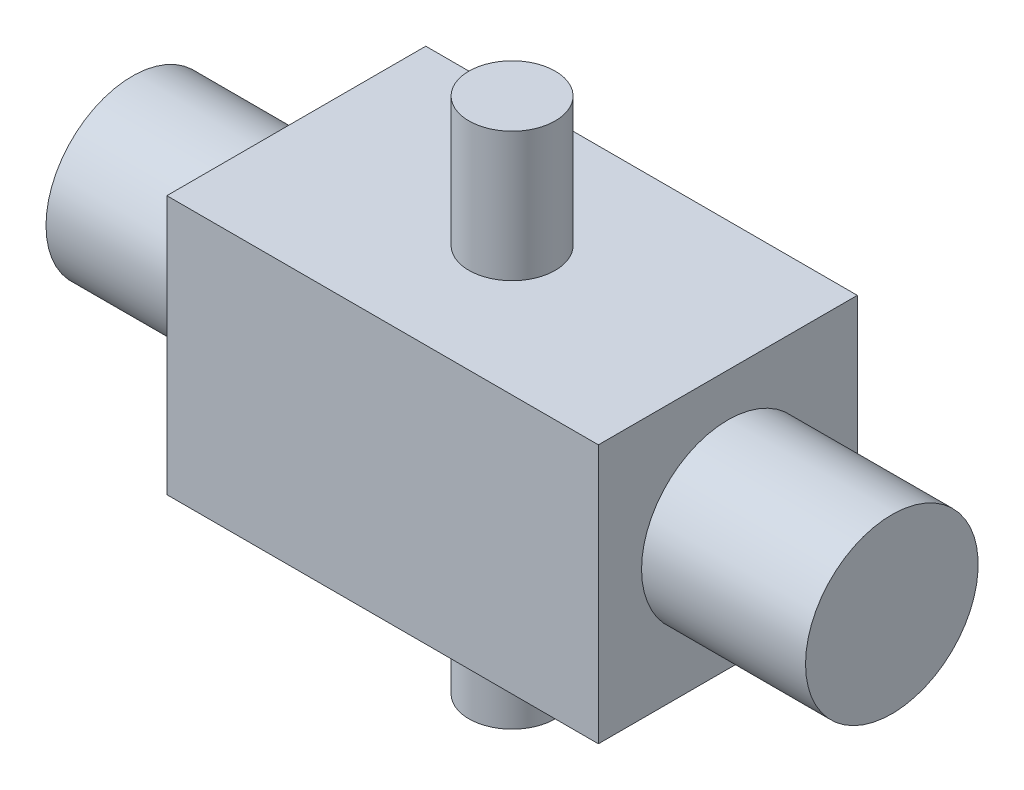
ISO-10303-21;
HEADER;
FILE_DESCRIPTION(('STEP AP214'),'2;1');
FILE_NAME('part.step','',(''),(''),'','','');
FILE_SCHEMA(('AUTOMOTIVE_DESIGN { 1 0 10303 214 1 1 1 1 }'));
ENDSEC;
DATA;
#1=APPLICATION_CONTEXT('core data for automotive mechanical design processes');
#2=APPLICATION_PROTOCOL_DEFINITION('international standard','automotive_design',2000,#1);
#3=PRODUCT_CONTEXT('',#1,'mechanical');
#4=PRODUCT('Part','Part','',(#3));
#5=PRODUCT_RELATED_PRODUCT_CATEGORY('part','',(#4));
#6=PRODUCT_DEFINITION_FORMATION('','',#4);
#7=PRODUCT_DEFINITION_CONTEXT('part definition',#1,'design');
#8=PRODUCT_DEFINITION('design','',#6,#7);
#9=PRODUCT_DEFINITION_SHAPE('','',#8);
#10=(LENGTH_UNIT() NAMED_UNIT(*) SI_UNIT(.MILLI.,.METRE.));
#11=(NAMED_UNIT(*) PLANE_ANGLE_UNIT() SI_UNIT($,.RADIAN.));
#12=(NAMED_UNIT(*) SI_UNIT($,.STERADIAN.) SOLID_ANGLE_UNIT());
#13=UNCERTAINTY_MEASURE_WITH_UNIT(LENGTH_MEASURE(1.E-05),#10,'distance_accuracy_value','');
#14=(GEOMETRIC_REPRESENTATION_CONTEXT(3) GLOBAL_UNCERTAINTY_ASSIGNED_CONTEXT((#13)) GLOBAL_UNIT_ASSIGNED_CONTEXT((#10,
#11,#12)) REPRESENTATION_CONTEXT('',''));
#15=CARTESIAN_POINT('',(0.,0.,0.));
#16=DIRECTION('',(0.,0.,1.));
#17=DIRECTION('',(1.,0.,0.));
#18=AXIS2_PLACEMENT_3D('',#15,#16,#17);
#19=CARTESIAN_POINT('',(-44.,-5.,0.));
#20=DIRECTION('',(-1.,0.,0.));
#21=DIRECTION('',(0.,0.,1.));
#22=AXIS2_PLACEMENT_3D('',#19,#20,#21);
#23=CYLINDRICAL_SURFACE('',#22,10.);
#24=CARTESIAN_POINT('',(25.,-5.,0.));
#25=DIRECTION('',(1.,0.,0.));
#26=DIRECTION('',(0.,0.,-1.));
#27=AXIS2_PLACEMENT_3D('',#24,#25,#26);
#28=CIRCLE('',#27,10.);
#29=CARTESIAN_POINT('',(25.,-5.,-10.));
#30=VERTEX_POINT('',#29);
#31=EDGE_CURVE('E11',#30,#30,#28,.F.);
#32=ORIENTED_EDGE('',*,*,#31,.F.);
#33=EDGE_LOOP('',(#32));
#34=FACE_BOUND('',#33,.T.);
#35=CARTESIAN_POINT('',(44.,-5.,0.));
#36=DIRECTION('',(-1.,0.,0.));
#37=DIRECTION('',(0.,0.,1.));
#38=AXIS2_PLACEMENT_3D('',#35,#36,#37);
#39=CIRCLE('',#38,10.);
#40=CARTESIAN_POINT('',(44.,-5.,10.));
#41=VERTEX_POINT('',#40);
#42=EDGE_CURVE('E144',#41,#41,#39,.T.);
#43=ORIENTED_EDGE('',*,*,#42,.T.);
#44=EDGE_LOOP('',(#43));
#45=FACE_BOUND('',#44,.T.);
#46=ADVANCED_FACE('F45',(#34,#45),#23,.T.);
#47=CARTESIAN_POINT('',(44.,5.,0.));
#48=DIRECTION('',(1.,0.,0.));
#49=DIRECTION('',(0.,0.,-1.));
#50=AXIS2_PLACEMENT_3D('',#47,#48,#49);
#51=PLANE('',#50);
#52=ORIENTED_EDGE('',*,*,#42,.F.);
#53=EDGE_LOOP('',(#52));
#54=FACE_BOUND('',#53,.T.);
#55=ADVANCED_FACE('F184',(#54),#51,.T.);
#56=CARTESIAN_POINT('',(25.,10.,-15.));
#57=DIRECTION('',(0.,0.,1.));
#58=DIRECTION('',(0.,-1.,0.));
#59=AXIS2_PLACEMENT_3D('',#56,#57,#58);
#60=PLANE('',#59);
#61=DIRECTION('',(0.,1.,0.));
#62=VECTOR('',#61,1.);
#63=CARTESIAN_POINT('',(-25.,10.,-15.));
#64=LINE('',#63,#62);
#65=CARTESIAN_POINT('',(-25.,-20.,-15.));
#66=VERTEX_POINT('',#65);
#67=CARTESIAN_POINT('',(-25.,10.,-15.));
#68=VERTEX_POINT('',#67);
#69=EDGE_CURVE('E118',#66,#68,#64,.T.);
#70=ORIENTED_EDGE('',*,*,#69,.T.);
#71=DIRECTION('',(-1.,0.,0.));
#72=VECTOR('',#71,1.);
#73=CARTESIAN_POINT('',(25.,10.,-15.));
#74=LINE('',#73,#72);
#75=CARTESIAN_POINT('',(25.,10.,-15.));
#76=VERTEX_POINT('',#75);
#77=EDGE_CURVE('E107',#76,#68,#74,.T.);
#78=ORIENTED_EDGE('',*,*,#77,.F.);
#79=DIRECTION('',(0.,1.,0.));
#80=VECTOR('',#79,1.);
#81=CARTESIAN_POINT('',(25.,10.,-15.));
#82=LINE('',#81,#80);
#83=CARTESIAN_POINT('',(25.,-20.,-15.));
#84=VERTEX_POINT('',#83);
#85=EDGE_CURVE('E99',#84,#76,#82,.T.);
#86=ORIENTED_EDGE('',*,*,#85,.F.);
#87=DIRECTION('',(-1.,0.,0.));
#88=VECTOR('',#87,1.);
#89=CARTESIAN_POINT('',(25.,-20.,-15.));
#90=LINE('',#89,#88);
#91=EDGE_CURVE('E114',#84,#66,#90,.T.);
#92=ORIENTED_EDGE('',*,*,#91,.T.);
#93=EDGE_LOOP('',(#70,#78,#86,#92));
#94=FACE_BOUND('',#93,.T.);
#95=ADVANCED_FACE('F170',(#94),#60,.F.);
#96=CARTESIAN_POINT('',(25.,10.,15.));
#97=DIRECTION('',(0.,-1.,0.));
#98=DIRECTION('',(0.,0.,-1.));
#99=AXIS2_PLACEMENT_3D('',#96,#97,#98);
#100=PLANE('',#99);
#101=CARTESIAN_POINT('',(0.,10.,0.));
#102=DIRECTION('',(0.,-1.,0.));
#103=DIRECTION('',(0.,0.,-1.));
#104=AXIS2_PLACEMENT_3D('',#101,#102,#103);
#105=CIRCLE('',#104,5.);
#106=CARTESIAN_POINT('',(0.,10.,-5.));
#107=VERTEX_POINT('',#106);
#108=EDGE_CURVE('E134',#107,#107,#105,.F.);
#109=ORIENTED_EDGE('',*,*,#108,.F.);
#110=EDGE_LOOP('',(#109));
#111=FACE_BOUND('',#110,.T.);
#112=DIRECTION('',(0.,0.,1.));
#113=VECTOR('',#112,1.);
#114=CARTESIAN_POINT('',(-25.,10.,15.));
#115=LINE('',#114,#113);
#116=CARTESIAN_POINT('',(-25.,10.,15.));
#117=VERTEX_POINT('',#116);
#118=EDGE_CURVE('E105',#68,#117,#115,.T.);
#119=ORIENTED_EDGE('',*,*,#118,.T.);
#120=DIRECTION('',(-1.,0.,0.));
#121=VECTOR('',#120,1.);
#122=CARTESIAN_POINT('',(25.,10.,15.));
#123=LINE('',#122,#121);
#124=CARTESIAN_POINT('',(25.,10.,15.));
#125=VERTEX_POINT('',#124);
#126=EDGE_CURVE('E103',#125,#117,#123,.T.);
#127=ORIENTED_EDGE('',*,*,#126,.F.);
#128=DIRECTION('',(0.,0.,1.));
#129=VECTOR('',#128,1.);
#130=CARTESIAN_POINT('',(25.,10.,15.));
#131=LINE('',#130,#129);
#132=EDGE_CURVE('E94',#76,#125,#131,.T.);
#133=ORIENTED_EDGE('',*,*,#132,.F.);
#134=ORIENTED_EDGE('',*,*,#77,.T.);
#135=EDGE_LOOP('',(#119,#127,#133,#134));
#136=FACE_BOUND('',#135,.T.);
#137=ADVANCED_FACE('F104',(#111,#136),#100,.F.);
#138=CARTESIAN_POINT('',(25.,10.,15.));
#139=DIRECTION('',(0.,0.,-1.));
#140=DIRECTION('',(0.,1.,0.));
#141=AXIS2_PLACEMENT_3D('',#138,#139,#140);
#142=PLANE('',#141);
#143=DIRECTION('',(0.,-1.,0.));
#144=VECTOR('',#143,1.);
#145=CARTESIAN_POINT('',(-25.,10.,15.));
#146=LINE('',#145,#144);
#147=CARTESIAN_POINT('',(-25.,-20.,15.));
#148=VERTEX_POINT('',#147);
#149=EDGE_CURVE('E80',#117,#148,#146,.T.);
#150=ORIENTED_EDGE('',*,*,#149,.T.);
#151=DIRECTION('',(-1.,0.,0.));
#152=VECTOR('',#151,1.);
#153=CARTESIAN_POINT('',(25.,-20.,15.));
#154=LINE('',#153,#152);
#155=CARTESIAN_POINT('',(25.,-20.,15.));
#156=VERTEX_POINT('',#155);
#157=EDGE_CURVE('E108',#156,#148,#154,.T.);
#158=ORIENTED_EDGE('',*,*,#157,.F.);
#159=DIRECTION('',(0.,-1.,0.));
#160=VECTOR('',#159,1.);
#161=CARTESIAN_POINT('',(25.,10.,15.));
#162=LINE('',#161,#160);
#163=EDGE_CURVE('E97',#125,#156,#162,.T.);
#164=ORIENTED_EDGE('',*,*,#163,.F.);
#165=ORIENTED_EDGE('',*,*,#126,.T.);
#166=EDGE_LOOP('',(#150,#158,#164,#165));
#167=FACE_BOUND('',#166,.T.);
#168=ADVANCED_FACE('F110',(#167),#142,.F.);
#169=CARTESIAN_POINT('',(25.,-20.,15.));
#170=DIRECTION('',(0.,1.,0.));
#171=DIRECTION('',(0.,0.,1.));
#172=AXIS2_PLACEMENT_3D('',#169,#170,#171);
#173=PLANE('',#172);
#174=CARTESIAN_POINT('',(0.,-20.,0.));
#175=DIRECTION('',(0.,1.,0.));
#176=DIRECTION('',(0.,0.,1.));
#177=AXIS2_PLACEMENT_3D('',#174,#175,#176);
#178=CIRCLE('',#177,5.);
#179=CARTESIAN_POINT('',(0.,-20.,5.));
#180=VERTEX_POINT('',#179);
#181=EDGE_CURVE('E154',#180,#180,#178,.F.);
#182=ORIENTED_EDGE('',*,*,#181,.F.);
#183=EDGE_LOOP('',(#182));
#184=FACE_BOUND('',#183,.T.);
#185=DIRECTION('',(0.,0.,-1.));
#186=VECTOR('',#185,1.);
#187=CARTESIAN_POINT('',(-25.,-20.,15.));
#188=LINE('',#187,#186);
#189=EDGE_CURVE('E86',#148,#66,#188,.T.);
#190=ORIENTED_EDGE('',*,*,#189,.T.);
#191=ORIENTED_EDGE('',*,*,#91,.F.);
#192=DIRECTION('',(0.,0.,-1.));
#193=VECTOR('',#192,1.);
#194=CARTESIAN_POINT('',(25.,-20.,15.));
#195=LINE('',#194,#193);
#196=EDGE_CURVE('E63',#156,#84,#195,.T.);
#197=ORIENTED_EDGE('',*,*,#196,.F.);
#198=ORIENTED_EDGE('',*,*,#157,.T.);
#199=EDGE_LOOP('',(#190,#191,#197,#198));
#200=FACE_BOUND('',#199,.T.);
#201=ADVANCED_FACE('F171',(#184,#200),#173,.F.);
#202=CARTESIAN_POINT('',(25.,0.,0.));
#203=DIRECTION('',(1.,0.,0.));
#204=DIRECTION('',(0.,0.,-1.));
#205=AXIS2_PLACEMENT_3D('',#202,#203,#204);
#206=PLANE('',#205);
#207=ORIENTED_EDGE('',*,*,#31,.T.);
#208=EDGE_LOOP('',(#207));
#209=FACE_BOUND('',#208,.T.);
#210=ORIENTED_EDGE('',*,*,#85,.T.);
#211=ORIENTED_EDGE('',*,*,#132,.T.);
#212=ORIENTED_EDGE('',*,*,#163,.T.);
#213=ORIENTED_EDGE('',*,*,#196,.T.);
#214=EDGE_LOOP('',(#210,#211,#212,#213));
#215=FACE_BOUND('',#214,.T.);
#216=ADVANCED_FACE('F95',(#209,#215),#206,.T.);
#217=CARTESIAN_POINT('',(-25.,0.,0.));
#218=DIRECTION('',(1.,0.,0.));
#219=DIRECTION('',(0.,0.,-1.));
#220=AXIS2_PLACEMENT_3D('',#217,#218,#219);
#221=PLANE('',#220);
#222=CARTESIAN_POINT('',(-25.,-5.,0.));
#223=DIRECTION('',(1.,0.,0.));
#224=DIRECTION('',(0.,0.,-1.));
#225=AXIS2_PLACEMENT_3D('',#222,#223,#224);
#226=CIRCLE('',#225,10.);
#227=CARTESIAN_POINT('',(-25.,-5.,-10.));
#228=VERTEX_POINT('',#227);
#229=EDGE_CURVE('E140',#228,#228,#226,.F.);
#230=ORIENTED_EDGE('',*,*,#229,.F.);
#231=EDGE_LOOP('',(#230));
#232=FACE_BOUND('',#231,.T.);
#233=ORIENTED_EDGE('',*,*,#69,.F.);
#234=ORIENTED_EDGE('',*,*,#189,.F.);
#235=ORIENTED_EDGE('',*,*,#149,.F.);
#236=ORIENTED_EDGE('',*,*,#118,.F.);
#237=EDGE_LOOP('',(#233,#234,#235,#236));
#238=FACE_BOUND('',#237,.T.);
#239=ADVANCED_FACE('F163',(#232,#238),#221,.F.);
#240=CARTESIAN_POINT('',(0.,-35.,0.));
#241=DIRECTION('',(0.,-1.,0.));
#242=DIRECTION('',(0.,0.,-1.));
#243=AXIS2_PLACEMENT_3D('',#240,#241,#242);
#244=PLANE('',#243);
#245=CARTESIAN_POINT('',(0.,-35.,0.));
#246=DIRECTION('',(0.,-1.,0.));
#247=DIRECTION('',(0.,0.,-1.));
#248=AXIS2_PLACEMENT_3D('',#245,#246,#247);
#249=CIRCLE('',#248,5.);
#250=CARTESIAN_POINT('',(0.,-35.,-5.));
#251=VERTEX_POINT('',#250);
#252=EDGE_CURVE('E135',#251,#251,#249,.T.);
#253=ORIENTED_EDGE('',*,*,#252,.T.);
#254=EDGE_LOOP('',(#253));
#255=FACE_BOUND('',#254,.T.);
#256=ADVANCED_FACE('F166',(#255),#244,.T.);
#257=CARTESIAN_POINT('',(0.,-35.,0.));
#258=DIRECTION('',(0.,-1.,0.));
#259=DIRECTION('',(0.,0.,-1.));
#260=AXIS2_PLACEMENT_3D('',#257,#258,#259);
#261=CYLINDRICAL_SURFACE('',#260,5.);
#262=ORIENTED_EDGE('',*,*,#252,.F.);
#263=EDGE_LOOP('',(#262));
#264=FACE_BOUND('',#263,.T.);
#265=ORIENTED_EDGE('',*,*,#181,.T.);
#266=EDGE_LOOP('',(#265));
#267=FACE_BOUND('',#266,.T.);
#268=ADVANCED_FACE('F206',(#264,#267),#261,.T.);
#269=CARTESIAN_POINT('',(-44.,5.,0.));
#270=DIRECTION('',(1.,0.,0.));
#271=DIRECTION('',(0.,0.,-1.));
#272=AXIS2_PLACEMENT_3D('',#269,#270,#271);
#273=PLANE('',#272);
#274=CARTESIAN_POINT('',(-44.,-5.,0.));
#275=DIRECTION('',(-1.,0.,0.));
#276=DIRECTION('',(0.,0.,1.));
#277=AXIS2_PLACEMENT_3D('',#274,#275,#276);
#278=CIRCLE('',#277,10.);
#279=CARTESIAN_POINT('',(-44.,-5.,10.));
#280=VERTEX_POINT('',#279);
#281=EDGE_CURVE('E55',#280,#280,#278,.T.);
#282=ORIENTED_EDGE('',*,*,#281,.T.);
#283=EDGE_LOOP('',(#282));
#284=FACE_BOUND('',#283,.T.);
#285=ADVANCED_FACE('F47',(#284),#273,.F.);
#286=ORIENTED_EDGE('',*,*,#281,.F.);
#287=EDGE_LOOP('',(#286));
#288=FACE_BOUND('',#287,.T.);
#289=ORIENTED_EDGE('',*,*,#229,.T.);
#290=EDGE_LOOP('',(#289));
#291=FACE_BOUND('',#290,.T.);
#292=ADVANCED_FACE('F161',(#288,#291),#23,.T.);
#293=CARTESIAN_POINT('',(0.,25.,0.));
#294=DIRECTION('',(0.,1.,0.));
#295=DIRECTION('',(0.,0.,1.));
#296=AXIS2_PLACEMENT_3D('',#293,#294,#295);
#297=PLANE('',#296);
#298=CARTESIAN_POINT('',(0.,25.,0.));
#299=DIRECTION('',(0.,-1.,0.));
#300=DIRECTION('',(0.,0.,-1.));
#301=AXIS2_PLACEMENT_3D('',#298,#299,#300);
#302=CIRCLE('',#301,5.);
#303=CARTESIAN_POINT('',(0.,25.,-5.));
#304=VERTEX_POINT('',#303);
#305=EDGE_CURVE('E139',#304,#304,#302,.T.);
#306=ORIENTED_EDGE('',*,*,#305,.F.);
#307=EDGE_LOOP('',(#306));
#308=FACE_BOUND('',#307,.T.);
#309=ADVANCED_FACE('F196',(#308),#297,.T.);
#310=ORIENTED_EDGE('',*,*,#305,.T.);
#311=EDGE_LOOP('',(#310));
#312=FACE_BOUND('',#311,.T.);
#313=ORIENTED_EDGE('',*,*,#108,.T.);
#314=EDGE_LOOP('',(#313));
#315=FACE_BOUND('',#314,.T.);
#316=ADVANCED_FACE('F202',(#312,#315),#261,.T.);
#317=CLOSED_SHELL('',(#46,#55,#95,#137,#168,#201,#216,#239,#256,#268,#285,#292,#309,#316));
#318=MANIFOLD_SOLID_BREP('B2',#317);
#319=ADVANCED_BREP_SHAPE_REPRESENTATION('',(#18,#318),#14);
#320=SHAPE_DEFINITION_REPRESENTATION(#9,#319);
ENDSEC;
END-ISO-10303-21;
